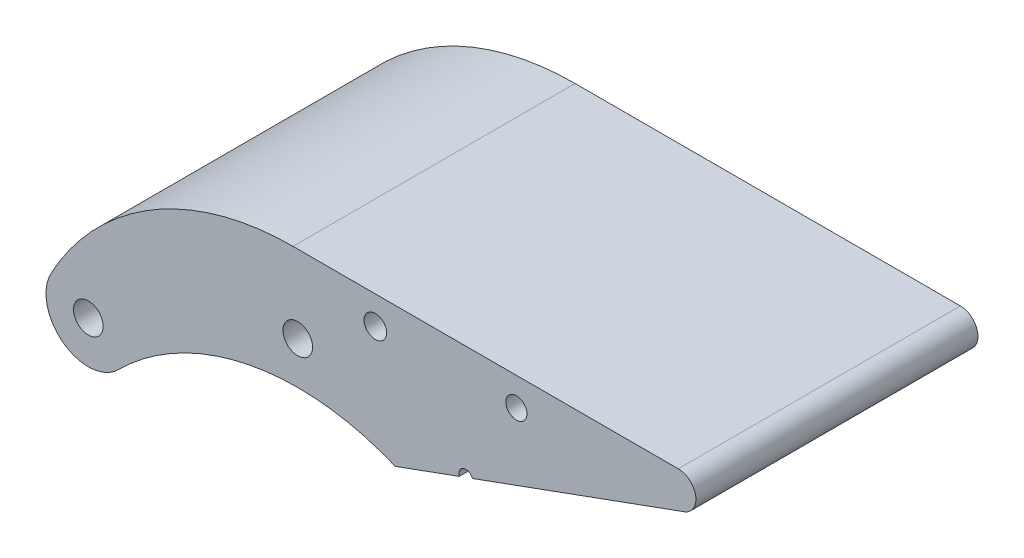
ISO-10303-21;
HEADER;
FILE_DESCRIPTION(('STEP AP214'),'2;1');
FILE_NAME('part.step','',(''),(''),'','','');
FILE_SCHEMA(('AUTOMOTIVE_DESIGN { 1 0 10303 214 1 1 1 1 }'));
ENDSEC;
DATA;
#1=APPLICATION_CONTEXT('core data for automotive mechanical design processes');
#2=APPLICATION_PROTOCOL_DEFINITION('international standard','automotive_design',2000,#1);
#3=PRODUCT_CONTEXT('',#1,'mechanical');
#4=PRODUCT('Part','Part','',(#3));
#5=PRODUCT_RELATED_PRODUCT_CATEGORY('part','',(#4));
#6=PRODUCT_DEFINITION_FORMATION('','',#4);
#7=PRODUCT_DEFINITION_CONTEXT('part definition',#1,'design');
#8=PRODUCT_DEFINITION('design','',#6,#7);
#9=PRODUCT_DEFINITION_SHAPE('','',#8);
#10=(LENGTH_UNIT() NAMED_UNIT(*) SI_UNIT(.MILLI.,.METRE.));
#11=(NAMED_UNIT(*) PLANE_ANGLE_UNIT() SI_UNIT($,.RADIAN.));
#12=(NAMED_UNIT(*) SI_UNIT($,.STERADIAN.) SOLID_ANGLE_UNIT());
#13=UNCERTAINTY_MEASURE_WITH_UNIT(LENGTH_MEASURE(1.E-05),#10,'distance_accuracy_value','');
#14=(GEOMETRIC_REPRESENTATION_CONTEXT(3) GLOBAL_UNCERTAINTY_ASSIGNED_CONTEXT((#13)) GLOBAL_UNIT_ASSIGNED_CONTEXT((#10,
#11,#12)) REPRESENTATION_CONTEXT('',''));
#15=CARTESIAN_POINT('',(0.,0.,0.));
#16=DIRECTION('',(0.,0.,1.));
#17=DIRECTION('',(1.,0.,0.));
#18=AXIS2_PLACEMENT_3D('',#15,#16,#17);
#19=CARTESIAN_POINT('',(-9.06353379813008,24.9018544508266,40.));
#20=DIRECTION('',(-0.342020143325663,0.93969262078591,0.));
#21=DIRECTION('',(-0.939692620785911,-0.342020143325663,0.));
#22=AXIS2_PLACEMENT_3D('',#19,#20,#21);
#23=PLANE('',#22);
#24=DIRECTION('',(0.939692620785911,0.342020143325663,0.));
#25=VECTOR('',#24,1.);
#26=CARTESIAN_POINT('',(-9.06353379813008,24.9018544508266,0.));
#27=LINE('',#26,#25);
#28=CARTESIAN_POINT('',(13.833943007207,33.2358544477699,0.));
#29=VERTEX_POINT('',#28);
#30=CARTESIAN_POINT('',(22.8942503864211,36.5335366471062,0.));
#31=VERTEX_POINT('',#30);
#32=EDGE_CURVE('E116',#29,#31,#27,.T.);
#33=ORIENTED_EDGE('',*,*,#32,.T.);
#34=DIRECTION('',(0.,0.,1.));
#35=VECTOR('',#34,1.);
#36=CARTESIAN_POINT('',(22.8942503864211,36.5335366471062,-0.001000000000001));
#37=LINE('',#36,#35);
#38=CARTESIAN_POINT('',(22.8942503864211,36.5335366471062,40.));
#39=VERTEX_POINT('',#38);
#40=EDGE_CURVE('E56',#39,#31,#37,.F.);
#41=ORIENTED_EDGE('',*,*,#40,.F.);
#42=DIRECTION('',(0.939692620785911,0.342020143325663,0.));
#43=VECTOR('',#42,1.);
#44=CARTESIAN_POINT('',(-9.06353379813008,24.9018544508266,40.));
#45=LINE('',#44,#43);
#46=CARTESIAN_POINT('',(13.833943007207,33.2358544477699,40.));
#47=VERTEX_POINT('',#46);
#48=EDGE_CURVE('E113',#47,#39,#45,.T.);
#49=ORIENTED_EDGE('',*,*,#48,.F.);
#50=DIRECTION('',(0.,0.,-1.));
#51=VECTOR('',#50,1.);
#52=CARTESIAN_POINT('',(13.833943007207,33.2358544477699,40.));
#53=LINE('',#52,#51);
#54=EDGE_CURVE('E132',#47,#29,#53,.T.);
#55=ORIENTED_EDGE('',*,*,#54,.T.);
#56=EDGE_LOOP('',(#33,#41,#49,#55));
#57=FACE_BOUND('',#56,.T.);
#58=ADVANCED_FACE('F41',(#57),#23,.F.);
#59=CARTESIAN_POINT('',(0.,53.,40.));
#60=DIRECTION('',(0.,1.,0.));
#61=DIRECTION('',(-1.,0.,0.));
#62=AXIS2_PLACEMENT_3D('',#59,#60,#61);
#63=PLANE('',#62);
#64=DIRECTION('',(1.,0.,0.));
#65=VECTOR('',#64,1.);
#66=CARTESIAN_POINT('',(0.,53.,40.));
#67=LINE('',#66,#65);
#68=CARTESIAN_POINT('',(-0.671642496634896,53.,40.));
#69=VERTEX_POINT('',#68);
#70=CARTESIAN_POINT('',(53.95728207773,53.,40.));
#71=VERTEX_POINT('',#70);
#72=EDGE_CURVE('E153',#69,#71,#67,.T.);
#73=ORIENTED_EDGE('',*,*,#72,.T.);
#74=DIRECTION('',(0.,0.,-1.));
#75=VECTOR('',#74,1.);
#76=CARTESIAN_POINT('',(53.95728207773,53.,0.));
#77=LINE('',#76,#75);
#78=CARTESIAN_POINT('',(53.95728207773,53.,0.));
#79=VERTEX_POINT('',#78);
#80=EDGE_CURVE('E162',#71,#79,#77,.T.);
#81=ORIENTED_EDGE('',*,*,#80,.T.);
#82=DIRECTION('',(1.,0.,0.));
#83=VECTOR('',#82,1.);
#84=CARTESIAN_POINT('',(0.,53.,0.));
#85=LINE('',#84,#83);
#86=CARTESIAN_POINT('',(-0.671642496634896,53.,0.));
#87=VERTEX_POINT('',#86);
#88=EDGE_CURVE('E133',#87,#79,#85,.T.);
#89=ORIENTED_EDGE('',*,*,#88,.F.);
#90=DIRECTION('',(0.,0.,-1.));
#91=VECTOR('',#90,1.);
#92=CARTESIAN_POINT('',(-0.671642496634896,53.,40.));
#93=LINE('',#92,#91);
#94=EDGE_CURVE('E160',#69,#87,#93,.T.);
#95=ORIENTED_EDGE('',*,*,#94,.F.);
#96=EDGE_LOOP('',(#73,#81,#89,#95));
#97=FACE_BOUND('',#96,.T.);
#98=ADVANCED_FACE('F177',(#97),#63,.T.);
#99=CARTESIAN_POINT('',(-0.671642496634893,14.,40.));
#100=DIRECTION('',(0.,0.,-1.));
#101=DIRECTION('',(-1.,0.,0.));
#102=AXIS2_PLACEMENT_3D('',#99,#100,#101);
#103=CYLINDRICAL_SURFACE('',#102,39.);
#104=CARTESIAN_POINT('',(-0.671642496634893,14.,0.));
#105=DIRECTION('',(0.,0.,1.));
#106=DIRECTION('',(1.,0.,0.));
#107=AXIS2_PLACEMENT_3D('',#104,#105,#106);
#108=CIRCLE('',#107,39.);
#109=CARTESIAN_POINT('',(-34.9760925031439,32.5527547752597,0.));
#110=VERTEX_POINT('',#109);
#111=EDGE_CURVE('E136',#87,#110,#108,.T.);
#112=ORIENTED_EDGE('',*,*,#111,.T.);
#113=DIRECTION('',(0.,0.,-1.));
#114=VECTOR('',#113,1.);
#115=CARTESIAN_POINT('',(-34.9760925031439,32.5527547752597,40.));
#116=LINE('',#115,#114);
#117=CARTESIAN_POINT('',(-34.9760925031439,32.5527547752597,40.));
#118=VERTEX_POINT('',#117);
#119=EDGE_CURVE('E157',#118,#110,#116,.T.);
#120=ORIENTED_EDGE('',*,*,#119,.F.);
#121=CARTESIAN_POINT('',(-0.671642496634893,14.,40.));
#122=DIRECTION('',(0.,0.,1.));
#123=DIRECTION('',(1.,0.,0.));
#124=AXIS2_PLACEMENT_3D('',#121,#122,#123);
#125=CIRCLE('',#124,39.);
#126=EDGE_CURVE('E180',#69,#118,#125,.T.);
#127=ORIENTED_EDGE('',*,*,#126,.F.);
#128=ORIENTED_EDGE('',*,*,#94,.T.);
#129=EDGE_LOOP('',(#112,#120,#127,#128));
#130=FACE_BOUND('',#129,.T.);
#131=ADVANCED_FACE('F230',(#130),#103,.T.);
#132=CARTESIAN_POINT('',(-29.6984848098348,29.6984848098351,40.));
#133=DIRECTION('',(0.,0.,-1.));
#134=DIRECTION('',(-1.,0.,0.));
#135=AXIS2_PLACEMENT_3D('',#132,#133,#134);
#136=CYLINDRICAL_SURFACE('',#135,6.00000000000001);
#137=CARTESIAN_POINT('',(-29.6984848098348,29.6984848098351,0.));
#138=DIRECTION('',(0.,0.,1.));
#139=DIRECTION('',(1.,0.,0.));
#140=AXIS2_PLACEMENT_3D('',#137,#138,#139);
#141=CIRCLE('',#140,6.00000000000001);
#142=CARTESIAN_POINT('',(-25.4558441227156,25.4558441227158,0.));
#143=VERTEX_POINT('',#142);
#144=EDGE_CURVE('E139',#110,#143,#141,.T.);
#145=ORIENTED_EDGE('',*,*,#144,.T.);
#146=DIRECTION('',(0.,0.,-1.));
#147=VECTOR('',#146,1.);
#148=CARTESIAN_POINT('',(-25.4558441227156,25.4558441227158,40.));
#149=LINE('',#148,#147);
#150=CARTESIAN_POINT('',(-25.4558441227156,25.4558441227158,40.));
#151=VERTEX_POINT('',#150);
#152=EDGE_CURVE('E155',#151,#143,#149,.T.);
#153=ORIENTED_EDGE('',*,*,#152,.F.);
#154=CARTESIAN_POINT('',(-29.6984848098348,29.6984848098351,40.));
#155=DIRECTION('',(0.,0.,1.));
#156=DIRECTION('',(1.,0.,0.));
#157=AXIS2_PLACEMENT_3D('',#154,#155,#156);
#158=CIRCLE('',#157,6.00000000000001);
#159=EDGE_CURVE('E182',#118,#151,#158,.T.);
#160=ORIENTED_EDGE('',*,*,#159,.F.);
#161=ORIENTED_EDGE('',*,*,#119,.T.);
#162=EDGE_LOOP('',(#145,#153,#160,#161));
#163=FACE_BOUND('',#162,.T.);
#164=ADVANCED_FACE('F243',(#163),#136,.T.);
#165=CARTESIAN_POINT('',(0.,0.,40.));
#166=DIRECTION('',(0.,0.,-1.));
#167=DIRECTION('',(-1.,0.,0.));
#168=AXIS2_PLACEMENT_3D('',#165,#166,#167);
#169=CYLINDRICAL_SURFACE('',#168,36.);
#170=CARTESIAN_POINT('',(0.,0.,0.));
#171=DIRECTION('',(0.,0.,1.));
#172=DIRECTION('',(1.,0.,0.));
#173=AXIS2_PLACEMENT_3D('',#170,#171,#172);
#174=CIRCLE('',#173,36.);
#175=EDGE_CURVE('E142',#29,#143,#174,.T.);
#176=ORIENTED_EDGE('',*,*,#175,.F.);
#177=ORIENTED_EDGE('',*,*,#54,.F.);
#178=CARTESIAN_POINT('',(0.,0.,40.));
#179=DIRECTION('',(0.,0.,1.));
#180=DIRECTION('',(1.,0.,0.));
#181=AXIS2_PLACEMENT_3D('',#178,#179,#180);
#182=CIRCLE('',#181,36.);
#183=EDGE_CURVE('E121',#47,#151,#182,.T.);
#184=ORIENTED_EDGE('',*,*,#183,.T.);
#185=ORIENTED_EDGE('',*,*,#152,.T.);
#186=EDGE_LOOP('',(#176,#177,#184,#185));
#187=FACE_BOUND('',#186,.T.);
#188=ADVANCED_FACE('F190',(#187),#169,.F.);
#189=CARTESIAN_POINT('',(0.,42.,40.));
#190=DIRECTION('',(0.,0.,-1.));
#191=DIRECTION('',(-1.,0.,0.));
#192=AXIS2_PLACEMENT_3D('',#189,#190,#191);
#193=CYLINDRICAL_SURFACE('',#192,2.1);
#194=CARTESIAN_POINT('',(0.,42.,40.));
#195=DIRECTION('',(0.,0.,1.));
#196=DIRECTION('',(1.,0.,0.));
#197=AXIS2_PLACEMENT_3D('',#194,#195,#196);
#198=CIRCLE('',#197,2.1);
#199=CARTESIAN_POINT('',(2.1,42.,40.));
#200=VERTEX_POINT('',#199);
#201=EDGE_CURVE('E122',#200,#200,#198,.T.);
#202=ORIENTED_EDGE('',*,*,#201,.T.);
#203=EDGE_LOOP('',(#202));
#204=FACE_BOUND('',#203,.T.);
#205=CARTESIAN_POINT('',(0.,42.,0.));
#206=DIRECTION('',(0.,0.,1.));
#207=DIRECTION('',(1.,0.,0.));
#208=AXIS2_PLACEMENT_3D('',#205,#206,#207);
#209=CIRCLE('',#208,2.1);
#210=CARTESIAN_POINT('',(2.1,42.,0.));
#211=VERTEX_POINT('',#210);
#212=EDGE_CURVE('E147',#211,#211,#209,.T.);
#213=ORIENTED_EDGE('',*,*,#212,.F.);
#214=EDGE_LOOP('',(#213));
#215=FACE_BOUND('',#214,.T.);
#216=ADVANCED_FACE('F233',(#204,#215),#193,.F.);
#217=CARTESIAN_POINT('',(24.7736356279929,37.2175769337576,40.));
#218=VERTEX_POINT('',#217);
#219=CARTESIAN_POINT('',(54.8123324360442,48.1507684480352,40.));
#220=VERTEX_POINT('',#219);
#221=EDGE_CURVE('E63',#218,#220,#45,.T.);
#222=ORIENTED_EDGE('',*,*,#221,.F.);
#223=DIRECTION('',(0.,0.,1.));
#224=VECTOR('',#223,1.);
#225=CARTESIAN_POINT('',(24.7736356279929,37.2175769337576,-0.001000000000001));
#226=LINE('',#225,#224);
#227=CARTESIAN_POINT('',(24.7736356279929,37.2175769337576,0.));
#228=VERTEX_POINT('',#227);
#229=EDGE_CURVE('E106',#228,#218,#226,.T.);
#230=ORIENTED_EDGE('',*,*,#229,.F.);
#231=CARTESIAN_POINT('',(54.8123324360442,48.1507684480352,0.));
#232=VERTEX_POINT('',#231);
#233=EDGE_CURVE('E145',#228,#232,#27,.T.);
#234=ORIENTED_EDGE('',*,*,#233,.T.);
#235=DIRECTION('',(0.,0.,-1.));
#236=VECTOR('',#235,1.);
#237=CARTESIAN_POINT('',(54.8123324360442,48.1507684480352,40.));
#238=LINE('',#237,#236);
#239=EDGE_CURVE('E49',#232,#220,#238,.F.);
#240=ORIENTED_EDGE('',*,*,#239,.T.);
#241=EDGE_LOOP('',(#222,#230,#234,#240));
#242=FACE_BOUND('',#241,.T.);
#243=ADVANCED_FACE('F170',(#242),#23,.F.);
#244=CARTESIAN_POINT('',(-29.6984848098348,29.6984848098351,40.));
#245=DIRECTION('',(0.,0.,-1.));
#246=DIRECTION('',(-1.,0.,0.));
#247=AXIS2_PLACEMENT_3D('',#244,#245,#246);
#248=CYLINDRICAL_SURFACE('',#247,2.1);
#249=CARTESIAN_POINT('',(-29.6984848098348,29.6984848098351,40.));
#250=DIRECTION('',(0.,0.,1.));
#251=DIRECTION('',(1.,0.,0.));
#252=AXIS2_PLACEMENT_3D('',#249,#250,#251);
#253=CIRCLE('',#252,2.1);
#254=CARTESIAN_POINT('',(-27.5984848098348,29.6984848098351,40.));
#255=VERTEX_POINT('',#254);
#256=EDGE_CURVE('E125',#255,#255,#253,.T.);
#257=ORIENTED_EDGE('',*,*,#256,.T.);
#258=EDGE_LOOP('',(#257));
#259=FACE_BOUND('',#258,.T.);
#260=CARTESIAN_POINT('',(-29.6984848098348,29.6984848098351,0.));
#261=DIRECTION('',(0.,0.,1.));
#262=DIRECTION('',(1.,0.,0.));
#263=AXIS2_PLACEMENT_3D('',#260,#261,#262);
#264=CIRCLE('',#263,2.1);
#265=CARTESIAN_POINT('',(-27.5984848098348,29.6984848098351,0.));
#266=VERTEX_POINT('',#265);
#267=EDGE_CURVE('E150',#266,#266,#264,.T.);
#268=ORIENTED_EDGE('',*,*,#267,.F.);
#269=EDGE_LOOP('',(#268));
#270=FACE_BOUND('',#269,.T.);
#271=ADVANCED_FACE('F219',(#259,#270),#248,.F.);
#272=CARTESIAN_POINT('',(0.,0.,40.));
#273=DIRECTION('',(0.,0.,1.));
#274=DIRECTION('',(1.,0.,0.));
#275=AXIS2_PLACEMENT_3D('',#272,#273,#274);
#276=PLANE('',#275);
#277=CARTESIAN_POINT('',(23.833943007207,36.8755567904319,40.));
#278=DIRECTION('',(0.,0.,1.));
#279=DIRECTION('',(1.,0.,0.));
#280=AXIS2_PLACEMENT_3D('',#277,#278,#279);
#281=CIRCLE('',#280,1.);
#282=EDGE_CURVE('E103',#218,#39,#281,.T.);
#283=ORIENTED_EDGE('',*,*,#282,.F.);
#284=ORIENTED_EDGE('',*,*,#221,.T.);
#285=CARTESIAN_POINT('',(53.95728207773,50.5,40.));
#286=DIRECTION('',(0.,0.,1.));
#287=DIRECTION('',(1.,0.,0.));
#288=AXIS2_PLACEMENT_3D('',#285,#286,#287);
#289=CIRCLE('',#288,2.5);
#290=EDGE_CURVE('E11',#220,#71,#289,.T.);
#291=ORIENTED_EDGE('',*,*,#290,.T.);
#292=ORIENTED_EDGE('',*,*,#72,.F.);
#293=ORIENTED_EDGE('',*,*,#126,.T.);
#294=ORIENTED_EDGE('',*,*,#159,.T.);
#295=ORIENTED_EDGE('',*,*,#183,.F.);
#296=ORIENTED_EDGE('',*,*,#48,.T.);
#297=EDGE_LOOP('',(#283,#284,#291,#292,#293,#294,#295,#296));
#298=FACE_BOUND('',#297,.T.);
#299=CARTESIAN_POINT('',(31.,49.,40.));
#300=DIRECTION('',(0.,0.,1.));
#301=DIRECTION('',(1.,0.,0.));
#302=AXIS2_PLACEMENT_3D('',#299,#300,#301);
#303=CIRCLE('',#302,1.5);
#304=CARTESIAN_POINT('',(32.5,49.,40.));
#305=VERTEX_POINT('',#304);
#306=EDGE_CURVE('E195',#305,#305,#303,.T.);
#307=ORIENTED_EDGE('',*,*,#306,.F.);
#308=EDGE_LOOP('',(#307));
#309=FACE_BOUND('',#308,.T.);
#310=CARTESIAN_POINT('',(11.,49.,40.));
#311=DIRECTION('',(0.,0.,1.));
#312=DIRECTION('',(1.,0.,0.));
#313=AXIS2_PLACEMENT_3D('',#310,#311,#312);
#314=CIRCLE('',#313,1.6);
#315=CARTESIAN_POINT('',(12.6,49.,40.));
#316=VERTEX_POINT('',#315);
#317=EDGE_CURVE('E202',#316,#316,#314,.T.);
#318=ORIENTED_EDGE('',*,*,#317,.F.);
#319=EDGE_LOOP('',(#318));
#320=FACE_BOUND('',#319,.T.);
#321=ORIENTED_EDGE('',*,*,#201,.F.);
#322=EDGE_LOOP('',(#321));
#323=FACE_BOUND('',#322,.T.);
#324=ORIENTED_EDGE('',*,*,#256,.F.);
#325=EDGE_LOOP('',(#324));
#326=FACE_BOUND('',#325,.T.);
#327=ADVANCED_FACE('F118',(#298,#309,#320,#323,#326),#276,.T.);
#328=CARTESIAN_POINT('',(0.,0.,0.));
#329=DIRECTION('',(0.,0.,1.));
#330=DIRECTION('',(1.,0.,0.));
#331=AXIS2_PLACEMENT_3D('',#328,#329,#330);
#332=PLANE('',#331);
#333=CARTESIAN_POINT('',(31.,49.,0.));
#334=DIRECTION('',(0.,0.,1.));
#335=DIRECTION('',(1.,0.,0.));
#336=AXIS2_PLACEMENT_3D('',#333,#334,#335);
#337=CIRCLE('',#336,1.5);
#338=CARTESIAN_POINT('',(32.5,49.,0.));
#339=VERTEX_POINT('',#338);
#340=EDGE_CURVE('E198',#339,#339,#337,.F.);
#341=ORIENTED_EDGE('',*,*,#340,.F.);
#342=EDGE_LOOP('',(#341));
#343=FACE_BOUND('',#342,.T.);
#344=CARTESIAN_POINT('',(11.,49.,0.));
#345=DIRECTION('',(0.,0.,1.));
#346=DIRECTION('',(1.,0.,0.));
#347=AXIS2_PLACEMENT_3D('',#344,#345,#346);
#348=CIRCLE('',#347,1.6);
#349=CARTESIAN_POINT('',(12.6,49.,0.));
#350=VERTEX_POINT('',#349);
#351=EDGE_CURVE('E137',#350,#350,#348,.F.);
#352=ORIENTED_EDGE('',*,*,#351,.F.);
#353=EDGE_LOOP('',(#352));
#354=FACE_BOUND('',#353,.T.);
#355=ORIENTED_EDGE('',*,*,#233,.F.);
#356=CARTESIAN_POINT('',(23.833943007207,36.8755567904319,0.));
#357=DIRECTION('',(0.,0.,1.));
#358=DIRECTION('',(1.,0.,0.));
#359=AXIS2_PLACEMENT_3D('',#356,#357,#358);
#360=CIRCLE('',#359,1.);
#361=EDGE_CURVE('E108',#31,#228,#360,.F.);
#362=ORIENTED_EDGE('',*,*,#361,.F.);
#363=ORIENTED_EDGE('',*,*,#32,.F.);
#364=ORIENTED_EDGE('',*,*,#175,.T.);
#365=ORIENTED_EDGE('',*,*,#144,.F.);
#366=ORIENTED_EDGE('',*,*,#111,.F.);
#367=ORIENTED_EDGE('',*,*,#88,.T.);
#368=CARTESIAN_POINT('',(53.95728207773,50.5,0.));
#369=DIRECTION('',(0.,0.,1.));
#370=DIRECTION('',(1.,0.,0.));
#371=AXIS2_PLACEMENT_3D('',#368,#369,#370);
#372=CIRCLE('',#371,2.5);
#373=EDGE_CURVE('E165',#79,#232,#372,.F.);
#374=ORIENTED_EDGE('',*,*,#373,.T.);
#375=EDGE_LOOP('',(#355,#362,#363,#364,#365,#366,#367,#374));
#376=FACE_BOUND('',#375,.T.);
#377=ORIENTED_EDGE('',*,*,#212,.T.);
#378=EDGE_LOOP('',(#377));
#379=FACE_BOUND('',#378,.T.);
#380=ORIENTED_EDGE('',*,*,#267,.T.);
#381=EDGE_LOOP('',(#380));
#382=FACE_BOUND('',#381,.T.);
#383=ADVANCED_FACE('F192',(#343,#354,#376,#379,#382),#332,.F.);
#384=CARTESIAN_POINT('',(53.95728207773,50.5,40.));
#385=DIRECTION('',(0.,0.,1.));
#386=DIRECTION('',(1.,0.,0.));
#387=AXIS2_PLACEMENT_3D('',#384,#385,#386);
#388=CYLINDRICAL_SURFACE('',#387,2.5);
#389=ORIENTED_EDGE('',*,*,#290,.F.);
#390=ORIENTED_EDGE('',*,*,#239,.F.);
#391=ORIENTED_EDGE('',*,*,#373,.F.);
#392=ORIENTED_EDGE('',*,*,#80,.F.);
#393=EDGE_LOOP('',(#389,#390,#391,#392));
#394=FACE_BOUND('',#393,.T.);
#395=ADVANCED_FACE('F43',(#394),#388,.T.);
#396=CARTESIAN_POINT('',(11.,49.,-0.001000000000001));
#397=DIRECTION('',(0.,0.,1.));
#398=DIRECTION('',(1.,0.,0.));
#399=AXIS2_PLACEMENT_3D('',#396,#397,#398);
#400=CYLINDRICAL_SURFACE('',#399,1.6);
#401=ORIENTED_EDGE('',*,*,#317,.T.);
#402=EDGE_LOOP('',(#401));
#403=FACE_BOUND('',#402,.T.);
#404=ORIENTED_EDGE('',*,*,#351,.T.);
#405=EDGE_LOOP('',(#404));
#406=FACE_BOUND('',#405,.T.);
#407=ADVANCED_FACE('F209',(#403,#406),#400,.F.);
#408=CARTESIAN_POINT('',(31.,49.,-0.001000000000001));
#409=DIRECTION('',(0.,0.,1.));
#410=DIRECTION('',(1.,0.,0.));
#411=AXIS2_PLACEMENT_3D('',#408,#409,#410);
#412=CYLINDRICAL_SURFACE('',#411,1.5);
#413=ORIENTED_EDGE('',*,*,#306,.T.);
#414=EDGE_LOOP('',(#413));
#415=FACE_BOUND('',#414,.T.);
#416=ORIENTED_EDGE('',*,*,#340,.T.);
#417=EDGE_LOOP('',(#416));
#418=FACE_BOUND('',#417,.T.);
#419=ADVANCED_FACE('F309',(#415,#418),#412,.F.);
#420=CARTESIAN_POINT('',(23.833943007207,36.8755567904319,-0.001000000000001));
#421=DIRECTION('',(0.,0.,1.));
#422=DIRECTION('',(1.,0.,0.));
#423=AXIS2_PLACEMENT_3D('',#420,#421,#422);
#424=CYLINDRICAL_SURFACE('',#423,1.);
#425=ORIENTED_EDGE('',*,*,#40,.T.);
#426=ORIENTED_EDGE('',*,*,#361,.T.);
#427=ORIENTED_EDGE('',*,*,#229,.T.);
#428=ORIENTED_EDGE('',*,*,#282,.T.);
#429=EDGE_LOOP('',(#425,#426,#427,#428));
#430=FACE_BOUND('',#429,.T.);
#431=ADVANCED_FACE('F104',(#430),#424,.F.);
#432=CLOSED_SHELL('',(#58,#98,#131,#164,#188,#216,#243,#271,#327,#383,#395,#407,#419,#431));
#433=MANIFOLD_SOLID_BREP('B2',#432);
#434=ADVANCED_BREP_SHAPE_REPRESENTATION('',(#18,#433),#14);
#435=SHAPE_DEFINITION_REPRESENTATION(#9,#434);
ENDSEC;
END-ISO-10303-21;
